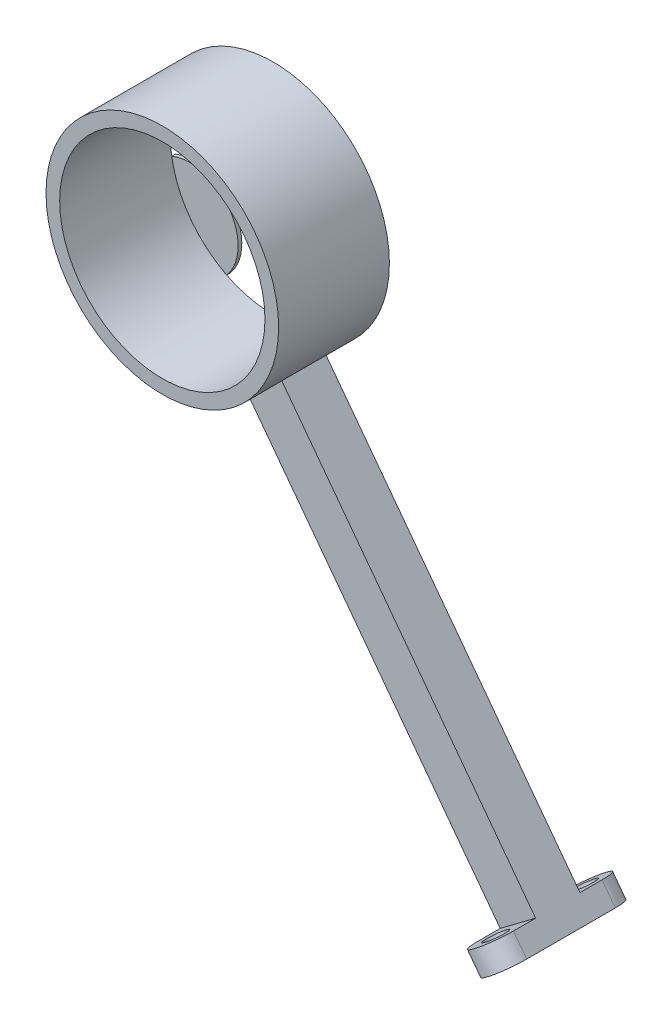
ISO-10303-21;
HEADER;
FILE_DESCRIPTION(('STEP AP214'),'2;1');
FILE_NAME('part.step','',(''),(''),'','','');
FILE_SCHEMA(('AUTOMOTIVE_DESIGN { 1 0 10303 214 1 1 1 1 }'));
ENDSEC;
DATA;
#1=APPLICATION_CONTEXT('core data for automotive mechanical design processes');
#2=APPLICATION_PROTOCOL_DEFINITION('international standard','automotive_design',2000,#1);
#3=PRODUCT_CONTEXT('',#1,'mechanical');
#4=PRODUCT('Part','Part','',(#3));
#5=PRODUCT_RELATED_PRODUCT_CATEGORY('part','',(#4));
#6=PRODUCT_DEFINITION_FORMATION('','',#4);
#7=PRODUCT_DEFINITION_CONTEXT('part definition',#1,'design');
#8=PRODUCT_DEFINITION('design','',#6,#7);
#9=PRODUCT_DEFINITION_SHAPE('','',#8);
#10=(LENGTH_UNIT() NAMED_UNIT(*) SI_UNIT(.MILLI.,.METRE.));
#11=(NAMED_UNIT(*) PLANE_ANGLE_UNIT() SI_UNIT($,.RADIAN.));
#12=(NAMED_UNIT(*) SI_UNIT($,.STERADIAN.) SOLID_ANGLE_UNIT());
#13=UNCERTAINTY_MEASURE_WITH_UNIT(LENGTH_MEASURE(1.E-05),#10,'distance_accuracy_value','');
#14=(GEOMETRIC_REPRESENTATION_CONTEXT(3) GLOBAL_UNCERTAINTY_ASSIGNED_CONTEXT((#13)) GLOBAL_UNIT_ASSIGNED_CONTEXT((#10,
#11,#12)) REPRESENTATION_CONTEXT('',''));
#15=CARTESIAN_POINT('',(0.,0.,0.));
#16=DIRECTION('',(0.,0.,1.));
#17=DIRECTION('',(1.,0.,0.));
#18=AXIS2_PLACEMENT_3D('',#15,#16,#17);
#19=CARTESIAN_POINT('',(-70.65,97.,-8.));
#20=DIRECTION('',(0.,0.,1.));
#21=DIRECTION('',(1.,0.,0.));
#22=AXIS2_PLACEMENT_3D('',#19,#20,#21);
#23=CYLINDRICAL_SURFACE('',#22,13.9);
#24=CARTESIAN_POINT('',(-70.65,97.,-7.5));
#25=DIRECTION('',(0.,0.,1.));
#26=DIRECTION('',(1.,0.,0.));
#27=AXIS2_PLACEMENT_3D('',#24,#25,#26);
#28=CIRCLE('',#27,13.9);
#29=CARTESIAN_POINT('',(-84.3779398757186,94.8197094760894,-7.5));
#30=VERTEX_POINT('',#29);
#31=CARTESIAN_POINT('',(-76.9364487667705,84.6028002394585,-7.5));
#32=VERTEX_POINT('',#31);
#33=EDGE_CURVE('E80',#30,#32,#28,.T.);
#34=ORIENTED_EDGE('',*,*,#33,.F.);
#35=DIRECTION('',(0.,0.,1.));
#36=VECTOR('',#35,1.);
#37=CARTESIAN_POINT('',(-84.3779398757186,94.8197094760894,-8.));
#38=LINE('',#37,#36);
#39=CARTESIAN_POINT('',(-84.3779398757186,94.8197094760894,-8.));
#40=VERTEX_POINT('',#39);
#41=EDGE_CURVE('E12',#40,#30,#38,.T.);
#42=ORIENTED_EDGE('',*,*,#41,.F.);
#43=CARTESIAN_POINT('',(-70.65,97.,-8.));
#44=DIRECTION('',(0.,0.,1.));
#45=DIRECTION('',(1.,0.,0.));
#46=AXIS2_PLACEMENT_3D('',#43,#44,#45);
#47=CIRCLE('',#46,13.9);
#48=CARTESIAN_POINT('',(-76.9364487667705,84.6028002394585,-8.));
#49=VERTEX_POINT('',#48);
#50=EDGE_CURVE('E82',#40,#49,#47,.T.);
#51=ORIENTED_EDGE('',*,*,#50,.T.);
#52=DIRECTION('',(0.,0.,1.));
#53=VECTOR('',#52,1.);
#54=CARTESIAN_POINT('',(-76.9364487667705,84.6028002394585,-8.));
#55=LINE('',#54,#53);
#56=EDGE_CURVE('E55',#49,#32,#55,.T.);
#57=ORIENTED_EDGE('',*,*,#56,.T.);
#58=EDGE_LOOP('',(#34,#42,#51,#57));
#59=FACE_BOUND('',#58,.T.);
#60=ADVANCED_FACE('F52',(#59),#23,.T.);
#61=CARTESIAN_POINT('',(-81.8856685057249,88.8164950522736,-8.));
#62=DIRECTION('',(0.,0.,1.));
#63=DIRECTION('',(1.,0.,0.));
#64=AXIS2_PLACEMENT_3D('',#61,#62,#63);
#65=CYLINDRICAL_SURFACE('',#64,6.50000000000001);
#66=CARTESIAN_POINT('',(-81.8856685057249,88.8164950522736,-7.5));
#67=DIRECTION('',(0.,0.,1.));
#68=DIRECTION('',(-1.,0.,0.));
#69=AXIS2_PLACEMENT_3D('',#66,#67,#68);
#70=CIRCLE('',#69,6.50000000000001);
#71=EDGE_CURVE('E74',#32,#30,#70,.T.);
#72=ORIENTED_EDGE('',*,*,#71,.F.);
#73=ORIENTED_EDGE('',*,*,#56,.F.);
#74=CARTESIAN_POINT('',(-81.8856685057249,88.8164950522736,-8.));
#75=DIRECTION('',(0.,0.,1.));
#76=DIRECTION('',(-1.,0.,0.));
#77=AXIS2_PLACEMENT_3D('',#74,#75,#76);
#78=CIRCLE('',#77,6.50000000000001);
#79=EDGE_CURVE('E68',#49,#40,#78,.T.);
#80=ORIENTED_EDGE('',*,*,#79,.T.);
#81=ORIENTED_EDGE('',*,*,#41,.T.);
#82=EDGE_LOOP('',(#72,#73,#80,#81));
#83=FACE_BOUND('',#82,.T.);
#84=ADVANCED_FACE('F85',(#83),#65,.T.);
#85=CARTESIAN_POINT('',(-76.2678342528624,92.9082475261368,-8.));
#86=DIRECTION('',(0.,0.,1.));
#87=DIRECTION('',(1.,0.,0.));
#88=AXIS2_PLACEMENT_3D('',#85,#86,#87);
#89=PLANE('',#88);
#90=ORIENTED_EDGE('',*,*,#50,.F.);
#91=ORIENTED_EDGE('',*,*,#79,.F.);
#92=EDGE_LOOP('',(#90,#91));
#93=FACE_BOUND('',#92,.T.);
#94=ADVANCED_FACE('F97',(#93),#89,.F.);
#95=CARTESIAN_POINT('',(-76.2678342528624,92.9082475261368,-7.5));
#96=DIRECTION('',(0.,0.,1.));
#97=DIRECTION('',(1.,0.,0.));
#98=AXIS2_PLACEMENT_3D('',#95,#96,#97);
#99=PLANE('',#98);
#100=ORIENTED_EDGE('',*,*,#33,.T.);
#101=ORIENTED_EDGE('',*,*,#71,.T.);
#102=EDGE_LOOP('',(#100,#101));
#103=FACE_BOUND('',#102,.T.);
#104=ADVANCED_FACE('F78',(#103),#99,.T.);
#105=CLOSED_SHELL('',(#60,#84,#94,#104));
#106=MANIFOLD_SOLID_BREP('B2',#105);
#107=CARTESIAN_POINT('',(-59.4143314942751,105.183504947726,-8.));
#108=DIRECTION('',(0.,0.,1.));
#109=DIRECTION('',(1.,0.,0.));
#110=AXIS2_PLACEMENT_3D('',#107,#108,#109);
#111=CYLINDRICAL_SURFACE('',#110,6.5);
#112=CARTESIAN_POINT('',(-59.4143314942751,105.183504947726,-7.5));
#113=DIRECTION('',(0.,0.,1.));
#114=DIRECTION('',(1.,0.,0.));
#115=AXIS2_PLACEMENT_3D('',#112,#113,#114);
#116=CIRCLE('',#115,6.5);
#117=CARTESIAN_POINT('',(-64.3635512332295,109.397199760542,-7.5));
#118=VERTEX_POINT('',#117);
#119=CARTESIAN_POINT('',(-56.9220601242813,99.1802905239107,-7.5));
#120=VERTEX_POINT('',#119);
#121=EDGE_CURVE('E50',#118,#120,#116,.T.);
#122=ORIENTED_EDGE('',*,*,#121,.F.);
#123=DIRECTION('',(0.,0.,1.));
#124=VECTOR('',#123,1.);
#125=CARTESIAN_POINT('',(-64.3635512332295,109.397199760542,-8.));
#126=LINE('',#125,#124);
#127=CARTESIAN_POINT('',(-64.3635512332295,109.397199760542,-8.));
#128=VERTEX_POINT('',#127);
#129=EDGE_CURVE('E181',#128,#118,#126,.T.);
#130=ORIENTED_EDGE('',*,*,#129,.F.);
#131=CARTESIAN_POINT('',(-59.4143314942751,105.183504947726,-8.));
#132=DIRECTION('',(0.,0.,1.));
#133=DIRECTION('',(1.,0.,0.));
#134=AXIS2_PLACEMENT_3D('',#131,#132,#133);
#135=CIRCLE('',#134,6.5);
#136=CARTESIAN_POINT('',(-56.9220601242813,99.1802905239107,-8.));
#137=VERTEX_POINT('',#136);
#138=EDGE_CURVE('E149',#128,#137,#135,.T.);
#139=ORIENTED_EDGE('',*,*,#138,.T.);
#140=DIRECTION('',(0.,0.,1.));
#141=VECTOR('',#140,1.);
#142=CARTESIAN_POINT('',(-56.9220601242813,99.1802905239107,-8.));
#143=LINE('',#142,#141);
#144=EDGE_CURVE('E176',#137,#120,#143,.T.);
#145=ORIENTED_EDGE('',*,*,#144,.T.);
#146=EDGE_LOOP('',(#122,#130,#139,#145));
#147=FACE_BOUND('',#146,.T.);
#148=ADVANCED_FACE('F145',(#147),#111,.T.);
#149=CARTESIAN_POINT('',(-70.65,97.,-8.));
#150=DIRECTION('',(0.,0.,1.));
#151=DIRECTION('',(1.,0.,0.));
#152=AXIS2_PLACEMENT_3D('',#149,#150,#151);
#153=CYLINDRICAL_SURFACE('',#152,13.9);
#154=CARTESIAN_POINT('',(-70.65,97.,-7.5));
#155=DIRECTION('',(0.,0.,1.));
#156=DIRECTION('',(-1.,0.,0.));
#157=AXIS2_PLACEMENT_3D('',#154,#155,#156);
#158=CIRCLE('',#157,13.9);
#159=EDGE_CURVE('E156',#120,#118,#158,.T.);
#160=ORIENTED_EDGE('',*,*,#159,.F.);
#161=ORIENTED_EDGE('',*,*,#144,.F.);
#162=CARTESIAN_POINT('',(-70.65,97.,-8.));
#163=DIRECTION('',(0.,0.,1.));
#164=DIRECTION('',(-1.,0.,0.));
#165=AXIS2_PLACEMENT_3D('',#162,#163,#164);
#166=CIRCLE('',#165,13.9);
#167=EDGE_CURVE('E170',#137,#128,#166,.T.);
#168=ORIENTED_EDGE('',*,*,#167,.T.);
#169=ORIENTED_EDGE('',*,*,#129,.T.);
#170=EDGE_LOOP('',(#160,#161,#168,#169));
#171=FACE_BOUND('',#170,.T.);
#172=ADVANCED_FACE('F177',(#171),#153,.T.);
#173=CARTESIAN_POINT('',(-65.0321657471376,101.091752473863,-8.));
#174=DIRECTION('',(0.,0.,1.));
#175=DIRECTION('',(1.,0.,0.));
#176=AXIS2_PLACEMENT_3D('',#173,#174,#175);
#177=PLANE('',#176);
#178=ORIENTED_EDGE('',*,*,#138,.F.);
#179=ORIENTED_EDGE('',*,*,#167,.F.);
#180=EDGE_LOOP('',(#178,#179));
#181=FACE_BOUND('',#180,.T.);
#182=ADVANCED_FACE('F147',(#181),#177,.F.);
#183=CARTESIAN_POINT('',(-65.0321657471376,101.091752473863,-7.5));
#184=DIRECTION('',(0.,0.,1.));
#185=DIRECTION('',(1.,0.,0.));
#186=AXIS2_PLACEMENT_3D('',#183,#184,#185);
#187=PLANE('',#186);
#188=ORIENTED_EDGE('',*,*,#121,.T.);
#189=ORIENTED_EDGE('',*,*,#159,.T.);
#190=EDGE_LOOP('',(#188,#189));
#191=FACE_BOUND('',#190,.T.);
#192=ADVANCED_FACE('F192',(#191),#187,.T.);
#193=CLOSED_SHELL('',(#148,#172,#182,#192));
#194=MANIFOLD_SOLID_BREP('B6',#193);
#195=CARTESIAN_POINT('',(-25.2,36.4,-10.01));
#196=DIRECTION('',(0.6,-0.8,0.));
#197=DIRECTION('',(0.8,0.6,0.));
#198=AXIS2_PLACEMENT_3D('',#195,#196,#197);
#199=PLANE('',#198);
#200=CARTESIAN_POINT('',(-25.2,36.4,6.));
#201=DIRECTION('',(0.6,-0.8,0.));
#202=DIRECTION('',(0.8,0.6,0.));
#203=AXIS2_PLACEMENT_3D('',#200,#201,#202);
#204=CIRCLE('',#203,3.);
#205=CARTESIAN_POINT('',(-22.8,38.2,6.));
#206=VERTEX_POINT('',#205);
#207=CARTESIAN_POINT('',(-27.6,34.6,6.));
#208=VERTEX_POINT('',#207);
#209=EDGE_CURVE('E338',#206,#208,#204,.T.);
#210=ORIENTED_EDGE('',*,*,#209,.T.);
#211=DIRECTION('',(0.,0.,-1.));
#212=VECTOR('',#211,1.);
#213=CARTESIAN_POINT('',(-27.6,34.6,-6.));
#214=LINE('',#213,#212);
#215=CARTESIAN_POINT('',(-27.6,34.6,-6.));
#216=VERTEX_POINT('',#215);
#217=EDGE_CURVE('E239',#208,#216,#214,.T.);
#218=ORIENTED_EDGE('',*,*,#217,.T.);
#219=CARTESIAN_POINT('',(-25.2,36.4,-6.));
#220=DIRECTION('',(0.6,-0.8,0.));
#221=DIRECTION('',(0.8,0.6,0.));
#222=AXIS2_PLACEMENT_3D('',#219,#220,#221);
#223=CIRCLE('',#222,3.);
#224=CARTESIAN_POINT('',(-22.8,38.2,-6.));
#225=VERTEX_POINT('',#224);
#226=EDGE_CURVE('E143',#216,#225,#223,.T.);
#227=ORIENTED_EDGE('',*,*,#226,.T.);
#228=DIRECTION('',(0.,0.,1.));
#229=VECTOR('',#228,1.);
#230=CARTESIAN_POINT('',(-22.8,38.2,-6.));
#231=LINE('',#230,#229);
#232=EDGE_CURVE('E342',#225,#206,#231,.T.);
#233=ORIENTED_EDGE('',*,*,#232,.T.);
#234=EDGE_LOOP('',(#210,#218,#227,#233));
#235=FACE_BOUND('',#234,.T.);
#236=CARTESIAN_POINT('',(-25.2,36.4,6.));
#237=DIRECTION('',(0.6,-0.8,0.));
#238=DIRECTION('',(0.8,0.6,0.));
#239=AXIS2_PLACEMENT_3D('',#236,#237,#238);
#240=CIRCLE('',#239,1.5);
#241=CARTESIAN_POINT('',(-24.,37.3,6.));
#242=VERTEX_POINT('',#241);
#243=EDGE_CURVE('E367',#242,#242,#240,.T.);
#244=ORIENTED_EDGE('',*,*,#243,.F.);
#245=EDGE_LOOP('',(#244));
#246=FACE_BOUND('',#245,.T.);
#247=CARTESIAN_POINT('',(-25.2,36.4,-6.));
#248=DIRECTION('',(0.6,-0.8,0.));
#249=DIRECTION('',(0.8,0.6,0.));
#250=AXIS2_PLACEMENT_3D('',#247,#248,#249);
#251=CIRCLE('',#250,1.5);
#252=CARTESIAN_POINT('',(-24.,37.3,-6.));
#253=VERTEX_POINT('',#252);
#254=EDGE_CURVE('E355',#253,#253,#251,.T.);
#255=ORIENTED_EDGE('',*,*,#254,.F.);
#256=EDGE_LOOP('',(#255));
#257=FACE_BOUND('',#256,.T.);
#258=ADVANCED_FACE('F229',(#235,#246,#257),#199,.T.);
#259=CARTESIAN_POINT('',(-70.65,97.,7.5));
#260=DIRECTION('',(0.,0.,-1.));
#261=DIRECTION('',(-1.,0.,0.));
#262=AXIS2_PLACEMENT_3D('',#259,#260,#261);
#263=CYLINDRICAL_SURFACE('',#262,13.9);
#264=CARTESIAN_POINT('',(-70.65,97.,7.5));
#265=DIRECTION('',(0.,0.,-1.));
#266=DIRECTION('',(-1.,0.,0.));
#267=AXIS2_PLACEMENT_3D('',#264,#265,#266);
#268=CIRCLE('',#267,13.9);
#269=CARTESIAN_POINT('',(-84.55,97.,7.5));
#270=VERTEX_POINT('',#269);
#271=EDGE_CURVE('E374',#270,#270,#268,.T.);
#272=ORIENTED_EDGE('',*,*,#271,.F.);
#273=EDGE_LOOP('',(#272));
#274=FACE_BOUND('',#273,.T.);
#275=CARTESIAN_POINT('',(-70.65,97.,-7.5));
#276=DIRECTION('',(0.,0.,-1.));
#277=DIRECTION('',(-1.,0.,0.));
#278=AXIS2_PLACEMENT_3D('',#275,#276,#277);
#279=CIRCLE('',#278,13.9);
#280=CARTESIAN_POINT('',(-84.55,97.,-7.5));
#281=VERTEX_POINT('',#280);
#282=EDGE_CURVE('E233',#281,#281,#279,.T.);
#283=ORIENTED_EDGE('',*,*,#282,.T.);
#284=EDGE_LOOP('',(#283));
#285=FACE_BOUND('',#284,.T.);
#286=ADVANCED_FACE('F231',(#274,#285),#263,.F.);
#287=CARTESIAN_POINT('',(-71.25,97.8,-7.5));
#288=DIRECTION('',(0.,0.,-1.));
#289=DIRECTION('',(-1.,0.,0.));
#290=AXIS2_PLACEMENT_3D('',#287,#288,#289);
#291=PLANE('',#290);
#292=ORIENTED_EDGE('',*,*,#282,.F.);
#293=EDGE_LOOP('',(#292));
#294=FACE_BOUND('',#293,.T.);
#295=CARTESIAN_POINT('',(-70.65,97.,-7.5));
#296=DIRECTION('',(0.,0.,-1.));
#297=DIRECTION('',(-1.,0.,0.));
#298=AXIS2_PLACEMENT_3D('',#295,#296,#297);
#299=CIRCLE('',#298,15.75);
#300=CARTESIAN_POINT('',(-86.4,97.,-7.5));
#301=VERTEX_POINT('',#300);
#302=EDGE_CURVE('E360',#301,#301,#299,.T.);
#303=ORIENTED_EDGE('',*,*,#302,.T.);
#304=EDGE_LOOP('',(#303));
#305=FACE_BOUND('',#304,.T.);
#306=ADVANCED_FACE('F386',(#294,#305),#291,.T.);
#307=CARTESIAN_POINT('',(-70.65,97.,7.5));
#308=DIRECTION('',(0.,0.,-1.));
#309=DIRECTION('',(-1.,0.,0.));
#310=AXIS2_PLACEMENT_3D('',#307,#308,#309);
#311=PLANE('',#310);
#312=ORIENTED_EDGE('',*,*,#271,.T.);
#313=EDGE_LOOP('',(#312));
#314=FACE_BOUND('',#313,.T.);
#315=CARTESIAN_POINT('',(-70.65,97.,7.5));
#316=DIRECTION('',(0.,0.,-1.));
#317=DIRECTION('',(-1.,0.,0.));
#318=AXIS2_PLACEMENT_3D('',#315,#316,#317);
#319=CIRCLE('',#318,15.75);
#320=CARTESIAN_POINT('',(-86.4,97.,7.5));
#321=VERTEX_POINT('',#320);
#322=EDGE_CURVE('E356',#321,#321,#319,.T.);
#323=ORIENTED_EDGE('',*,*,#322,.F.);
#324=EDGE_LOOP('',(#323));
#325=FACE_BOUND('',#324,.T.);
#326=ADVANCED_FACE('F389',(#314,#325),#311,.F.);
#327=CARTESIAN_POINT('',(-29.4,37.,-6.));
#328=DIRECTION('',(-0.8,-0.6,0.));
#329=DIRECTION('',(0.6,-0.8,0.));
#330=AXIS2_PLACEMENT_3D('',#327,#328,#329);
#331=PLANE('',#330);
#332=DIRECTION('',(0.,0.,-1.));
#333=VECTOR('',#332,1.);
#334=CARTESIAN_POINT('',(-63.7730123423603,82.8306831231471,7.5));
#335=LINE('',#334,#333);
#336=CARTESIAN_POINT('',(-63.7730123423603,82.830683123147,-3.));
#337=VERTEX_POINT('',#336);
#338=CARTESIAN_POINT('',(-63.7730123423603,82.8306831231471,3.));
#339=VERTEX_POINT('',#338);
#340=EDGE_CURVE('E361',#337,#339,#335,.F.);
#341=ORIENTED_EDGE('',*,*,#340,.F.);
#342=DIRECTION('',(0.6,-0.8,0.));
#343=VECTOR('',#342,1.);
#344=CARTESIAN_POINT('',(-65.4,85.,-3.));
#345=LINE('',#344,#343);
#346=CARTESIAN_POINT('',(-29.4,37.,-3.));
#347=VERTEX_POINT('',#346);
#348=EDGE_CURVE('E444',#337,#347,#345,.T.);
#349=ORIENTED_EDGE('',*,*,#348,.T.);
#350=DIRECTION('',(0.,0.,-1.));
#351=VECTOR('',#350,1.);
#352=CARTESIAN_POINT('',(-29.4,37.,-6.));
#353=LINE('',#352,#351);
#354=CARTESIAN_POINT('',(-29.4,37.,-6.));
#355=VERTEX_POINT('',#354);
#356=EDGE_CURVE('E430',#347,#355,#353,.T.);
#357=ORIENTED_EDGE('',*,*,#356,.T.);
#358=DIRECTION('',(0.6,-0.8,0.));
#359=VECTOR('',#358,1.);
#360=CARTESIAN_POINT('',(-29.4,37.,-6.));
#361=LINE('',#360,#359);
#362=EDGE_CURVE('E352',#355,#216,#361,.T.);
#363=ORIENTED_EDGE('',*,*,#362,.T.);
#364=ORIENTED_EDGE('',*,*,#217,.F.);
#365=DIRECTION('',(0.6,-0.8,0.));
#366=VECTOR('',#365,1.);
#367=CARTESIAN_POINT('',(-29.4,37.,6.));
#368=LINE('',#367,#366);
#369=CARTESIAN_POINT('',(-29.4,37.,6.));
#370=VERTEX_POINT('',#369);
#371=EDGE_CURVE('E247',#370,#208,#368,.T.);
#372=ORIENTED_EDGE('',*,*,#371,.F.);
#373=CARTESIAN_POINT('',(-29.4,37.,3.));
#374=VERTEX_POINT('',#373);
#375=EDGE_CURVE('E331',#370,#374,#353,.T.);
#376=ORIENTED_EDGE('',*,*,#375,.T.);
#377=DIRECTION('',(0.6,-0.8,0.));
#378=VECTOR('',#377,1.);
#379=CARTESIAN_POINT('',(-65.4,85.,3.));
#380=LINE('',#379,#378);
#381=EDGE_CURVE('E308',#339,#374,#380,.T.);
#382=ORIENTED_EDGE('',*,*,#381,.F.);
#383=EDGE_LOOP('',(#341,#349,#357,#363,#364,#372,#376,#382));
#384=FACE_BOUND('',#383,.T.);
#385=ADVANCED_FACE('F440',(#384),#331,.T.);
#386=CARTESIAN_POINT('',(-60.6,88.6,-3.));
#387=DIRECTION('',(0.,0.,-1.));
#388=DIRECTION('',(-1.,0.,0.));
#389=AXIS2_PLACEMENT_3D('',#386,#387,#388);
#390=PLANE('',#389);
#391=CARTESIAN_POINT('',(-70.65,97.,-3.));
#392=DIRECTION('',(0.,0.,-1.));
#393=DIRECTION('',(-1.,0.,0.));
#394=AXIS2_PLACEMENT_3D('',#391,#392,#393);
#395=CIRCLE('',#394,15.75);
#396=CARTESIAN_POINT('',(-58.9730123423603,86.430683123147,-3.));
#397=VERTEX_POINT('',#396);
#398=EDGE_CURVE('E345',#397,#337,#395,.T.);
#399=ORIENTED_EDGE('',*,*,#398,.F.);
#400=DIRECTION('',(0.6,-0.8,0.));
#401=VECTOR('',#400,1.);
#402=CARTESIAN_POINT('',(-60.6,88.6,-3.));
#403=LINE('',#402,#401);
#404=CARTESIAN_POINT('',(-24.6,40.6,-3.));
#405=VERTEX_POINT('',#404);
#406=EDGE_CURVE('E309',#397,#405,#403,.T.);
#407=ORIENTED_EDGE('',*,*,#406,.T.);
#408=DIRECTION('',(0.8,0.6,0.));
#409=VECTOR('',#408,1.);
#410=CARTESIAN_POINT('',(-24.6,40.6,-3.));
#411=LINE('',#410,#409);
#412=EDGE_CURVE('E319',#347,#405,#411,.T.);
#413=ORIENTED_EDGE('',*,*,#412,.F.);
#414=ORIENTED_EDGE('',*,*,#348,.F.);
#415=EDGE_LOOP('',(#399,#407,#413,#414));
#416=FACE_BOUND('',#415,.T.);
#417=ADVANCED_FACE('F464',(#416),#390,.T.);
#418=CARTESIAN_POINT('',(-27.,38.8,-6.));
#419=DIRECTION('',(-0.6,0.8,0.));
#420=DIRECTION('',(0.8,0.6,0.));
#421=AXIS2_PLACEMENT_3D('',#418,#419,#420);
#422=PLANE('',#421);
#423=CARTESIAN_POINT('',(-27.,38.8,-6.));
#424=DIRECTION('',(0.6,-0.8,0.));
#425=DIRECTION('',(0.8,0.6,0.));
#426=AXIS2_PLACEMENT_3D('',#423,#424,#425);
#427=CIRCLE('',#426,1.5);
#428=CARTESIAN_POINT('',(-25.8,39.7,-6.));
#429=VERTEX_POINT('',#428);
#430=EDGE_CURVE('E426',#429,#429,#427,.T.);
#431=ORIENTED_EDGE('',*,*,#430,.T.);
#432=EDGE_LOOP('',(#431));
#433=FACE_BOUND('',#432,.T.);
#434=ORIENTED_EDGE('',*,*,#356,.F.);
#435=ORIENTED_EDGE('',*,*,#412,.T.);
#436=DIRECTION('',(0.,0.,1.));
#437=VECTOR('',#436,1.);
#438=CARTESIAN_POINT('',(-24.6,40.6,-6.));
#439=LINE('',#438,#437);
#440=CARTESIAN_POINT('',(-24.6,40.6,-6.));
#441=VERTEX_POINT('',#440);
#442=EDGE_CURVE('E325',#441,#405,#439,.T.);
#443=ORIENTED_EDGE('',*,*,#442,.F.);
#444=CARTESIAN_POINT('',(-27.,38.8,-6.));
#445=DIRECTION('',(0.6,-0.8,0.));
#446=DIRECTION('',(0.8,0.6,0.));
#447=AXIS2_PLACEMENT_3D('',#444,#445,#446);
#448=CIRCLE('',#447,3.);
#449=EDGE_CURVE('E427',#355,#441,#448,.T.);
#450=ORIENTED_EDGE('',*,*,#449,.F.);
#451=EDGE_LOOP('',(#434,#435,#443,#450));
#452=FACE_BOUND('',#451,.T.);
#453=ADVANCED_FACE('F447',(#433,#452),#422,.T.);
#454=CARTESIAN_POINT('',(-27.,38.8,-6.));
#455=DIRECTION('',(0.6,-0.8,0.));
#456=DIRECTION('',(0.8,0.6,0.));
#457=AXIS2_PLACEMENT_3D('',#454,#455,#456);
#458=CYLINDRICAL_SURFACE('',#457,3.);
#459=ORIENTED_EDGE('',*,*,#226,.F.);
#460=ORIENTED_EDGE('',*,*,#362,.F.);
#461=ORIENTED_EDGE('',*,*,#449,.T.);
#462=DIRECTION('',(0.6,-0.8,0.));
#463=VECTOR('',#462,1.);
#464=CARTESIAN_POINT('',(-24.6,40.6,-6.));
#465=LINE('',#464,#463);
#466=EDGE_CURVE('E330',#441,#225,#465,.T.);
#467=ORIENTED_EDGE('',*,*,#466,.T.);
#468=EDGE_LOOP('',(#459,#460,#461,#467));
#469=FACE_BOUND('',#468,.T.);
#470=ADVANCED_FACE('F451',(#469),#458,.T.);
#471=CARTESIAN_POINT('',(-27.,38.8,6.));
#472=DIRECTION('',(0.6,-0.8,0.));
#473=DIRECTION('',(0.8,0.6,0.));
#474=AXIS2_PLACEMENT_3D('',#471,#472,#473);
#475=CYLINDRICAL_SURFACE('',#474,3.);
#476=ORIENTED_EDGE('',*,*,#209,.F.);
#477=DIRECTION('',(0.6,-0.8,0.));
#478=VECTOR('',#477,1.);
#479=CARTESIAN_POINT('',(-24.6,40.6,6.));
#480=LINE('',#479,#478);
#481=CARTESIAN_POINT('',(-24.6,40.6,6.));
#482=VERTEX_POINT('',#481);
#483=EDGE_CURVE('E255',#482,#206,#480,.T.);
#484=ORIENTED_EDGE('',*,*,#483,.F.);
#485=CARTESIAN_POINT('',(-27.,38.8,6.));
#486=DIRECTION('',(0.6,-0.8,0.));
#487=DIRECTION('',(0.8,0.6,0.));
#488=AXIS2_PLACEMENT_3D('',#485,#486,#487);
#489=CIRCLE('',#488,3.);
#490=EDGE_CURVE('E323',#482,#370,#489,.T.);
#491=ORIENTED_EDGE('',*,*,#490,.T.);
#492=ORIENTED_EDGE('',*,*,#371,.T.);
#493=EDGE_LOOP('',(#476,#484,#491,#492));
#494=FACE_BOUND('',#493,.T.);
#495=ADVANCED_FACE('F452',(#494),#475,.T.);
#496=CARTESIAN_POINT('',(-27.,38.8,6.));
#497=DIRECTION('',(0.6,-0.8,0.));
#498=DIRECTION('',(0.8,0.6,0.));
#499=AXIS2_PLACEMENT_3D('',#496,#497,#498);
#500=CIRCLE('',#499,1.5);
#501=CARTESIAN_POINT('',(-25.8,39.7,6.));
#502=VERTEX_POINT('',#501);
#503=EDGE_CURVE('E551',#502,#502,#500,.T.);
#504=ORIENTED_EDGE('',*,*,#503,.T.);
#505=EDGE_LOOP('',(#504));
#506=FACE_BOUND('',#505,.T.);
#507=CARTESIAN_POINT('',(-24.6,40.6,3.));
#508=VERTEX_POINT('',#507);
#509=EDGE_CURVE('E301',#508,#482,#439,.T.);
#510=ORIENTED_EDGE('',*,*,#509,.F.);
#511=DIRECTION('',(-0.8,-0.6,0.));
#512=VECTOR('',#511,1.);
#513=CARTESIAN_POINT('',(-24.6,40.6,3.));
#514=LINE('',#513,#512);
#515=EDGE_CURVE('E312',#508,#374,#514,.T.);
#516=ORIENTED_EDGE('',*,*,#515,.T.);
#517=ORIENTED_EDGE('',*,*,#375,.F.);
#518=ORIENTED_EDGE('',*,*,#490,.F.);
#519=EDGE_LOOP('',(#510,#516,#517,#518));
#520=FACE_BOUND('',#519,.T.);
#521=ADVANCED_FACE('F322',(#506,#520),#422,.T.);
#522=CARTESIAN_POINT('',(-60.6,88.6,3.));
#523=DIRECTION('',(0.,0.,1.));
#524=DIRECTION('',(1.,0.,0.));
#525=AXIS2_PLACEMENT_3D('',#522,#523,#524);
#526=PLANE('',#525);
#527=CARTESIAN_POINT('',(-70.65,97.,3.));
#528=DIRECTION('',(0.,0.,1.));
#529=DIRECTION('',(1.,0.,0.));
#530=AXIS2_PLACEMENT_3D('',#527,#528,#529);
#531=CIRCLE('',#530,15.75);
#532=CARTESIAN_POINT('',(-58.9730123423603,86.430683123147,3.));
#533=VERTEX_POINT('',#532);
#534=EDGE_CURVE('E320',#339,#533,#531,.T.);
#535=ORIENTED_EDGE('',*,*,#534,.F.);
#536=ORIENTED_EDGE('',*,*,#381,.T.);
#537=ORIENTED_EDGE('',*,*,#515,.F.);
#538=DIRECTION('',(0.6,-0.8,0.));
#539=VECTOR('',#538,1.);
#540=CARTESIAN_POINT('',(-60.6,88.6,3.));
#541=LINE('',#540,#539);
#542=EDGE_CURVE('E297',#533,#508,#541,.T.);
#543=ORIENTED_EDGE('',*,*,#542,.F.);
#544=EDGE_LOOP('',(#535,#536,#537,#543));
#545=FACE_BOUND('',#544,.T.);
#546=ADVANCED_FACE('F313',(#545),#526,.T.);
#547=CARTESIAN_POINT('',(-70.65,97.,7.5));
#548=DIRECTION('',(0.,0.,-1.));
#549=DIRECTION('',(-1.,0.,0.));
#550=AXIS2_PLACEMENT_3D('',#547,#548,#549);
#551=CYLINDRICAL_SURFACE('',#550,15.75);
#552=ORIENTED_EDGE('',*,*,#340,.T.);
#553=ORIENTED_EDGE('',*,*,#534,.T.);
#554=DIRECTION('',(0.,0.,-1.));
#555=VECTOR('',#554,1.);
#556=CARTESIAN_POINT('',(-58.9730123423603,86.430683123147,7.5));
#557=LINE('',#556,#555);
#558=EDGE_CURVE('E304',#533,#397,#557,.T.);
#559=ORIENTED_EDGE('',*,*,#558,.T.);
#560=ORIENTED_EDGE('',*,*,#398,.T.);
#561=EDGE_LOOP('',(#552,#553,#559,#560));
#562=FACE_BOUND('',#561,.T.);
#563=ORIENTED_EDGE('',*,*,#322,.T.);
#564=EDGE_LOOP('',(#563));
#565=FACE_BOUND('',#564,.T.);
#566=ORIENTED_EDGE('',*,*,#302,.F.);
#567=EDGE_LOOP('',(#566));
#568=FACE_BOUND('',#567,.T.);
#569=ADVANCED_FACE('F393',(#562,#565,#568),#551,.T.);
#570=CARTESIAN_POINT('',(-24.6,40.6,-6.));
#571=DIRECTION('',(0.8,0.6,0.));
#572=DIRECTION('',(-0.6,0.8,0.));
#573=AXIS2_PLACEMENT_3D('',#570,#571,#572);
#574=PLANE('',#573);
#575=ORIENTED_EDGE('',*,*,#558,.F.);
#576=ORIENTED_EDGE('',*,*,#542,.T.);
#577=ORIENTED_EDGE('',*,*,#509,.T.);
#578=ORIENTED_EDGE('',*,*,#483,.T.);
#579=ORIENTED_EDGE('',*,*,#232,.F.);
#580=ORIENTED_EDGE('',*,*,#466,.F.);
#581=ORIENTED_EDGE('',*,*,#442,.T.);
#582=ORIENTED_EDGE('',*,*,#406,.F.);
#583=EDGE_LOOP('',(#575,#576,#577,#578,#579,#580,#581,#582));
#584=FACE_BOUND('',#583,.T.);
#585=ADVANCED_FACE('F299',(#584),#574,.T.);
#586=CARTESIAN_POINT('',(-27.,38.8,6.));
#587=DIRECTION('',(0.6,-0.8,0.));
#588=DIRECTION('',(0.8,0.6,0.));
#589=AXIS2_PLACEMENT_3D('',#586,#587,#588);
#590=CYLINDRICAL_SURFACE('',#589,1.5);
#591=ORIENTED_EDGE('',*,*,#503,.F.);
#592=EDGE_LOOP('',(#591));
#593=FACE_BOUND('',#592,.T.);
#594=ORIENTED_EDGE('',*,*,#243,.T.);
#595=EDGE_LOOP('',(#594));
#596=FACE_BOUND('',#595,.T.);
#597=ADVANCED_FACE('F401',(#593,#596),#590,.F.);
#598=CARTESIAN_POINT('',(-27.,38.8,-6.));
#599=DIRECTION('',(0.6,-0.8,0.));
#600=DIRECTION('',(0.8,0.6,0.));
#601=AXIS2_PLACEMENT_3D('',#598,#599,#600);
#602=CYLINDRICAL_SURFACE('',#601,1.5);
#603=ORIENTED_EDGE('',*,*,#430,.F.);
#604=EDGE_LOOP('',(#603));
#605=FACE_BOUND('',#604,.T.);
#606=ORIENTED_EDGE('',*,*,#254,.T.);
#607=EDGE_LOOP('',(#606));
#608=FACE_BOUND('',#607,.T.);
#609=ADVANCED_FACE('F534',(#605,#608),#602,.F.);
#610=CLOSED_SHELL('',(#258,#286,#306,#326,#385,#417,#453,#470,#495,#521,#546,#569,#585,#597,#609));
#611=MANIFOLD_SOLID_BREP('B44',#610);
#612=ADVANCED_BREP_SHAPE_REPRESENTATION('',(#18,#106,#194,#611),#14);
#613=SHAPE_DEFINITION_REPRESENTATION(#9,#612);
ENDSEC;
END-ISO-10303-21;
